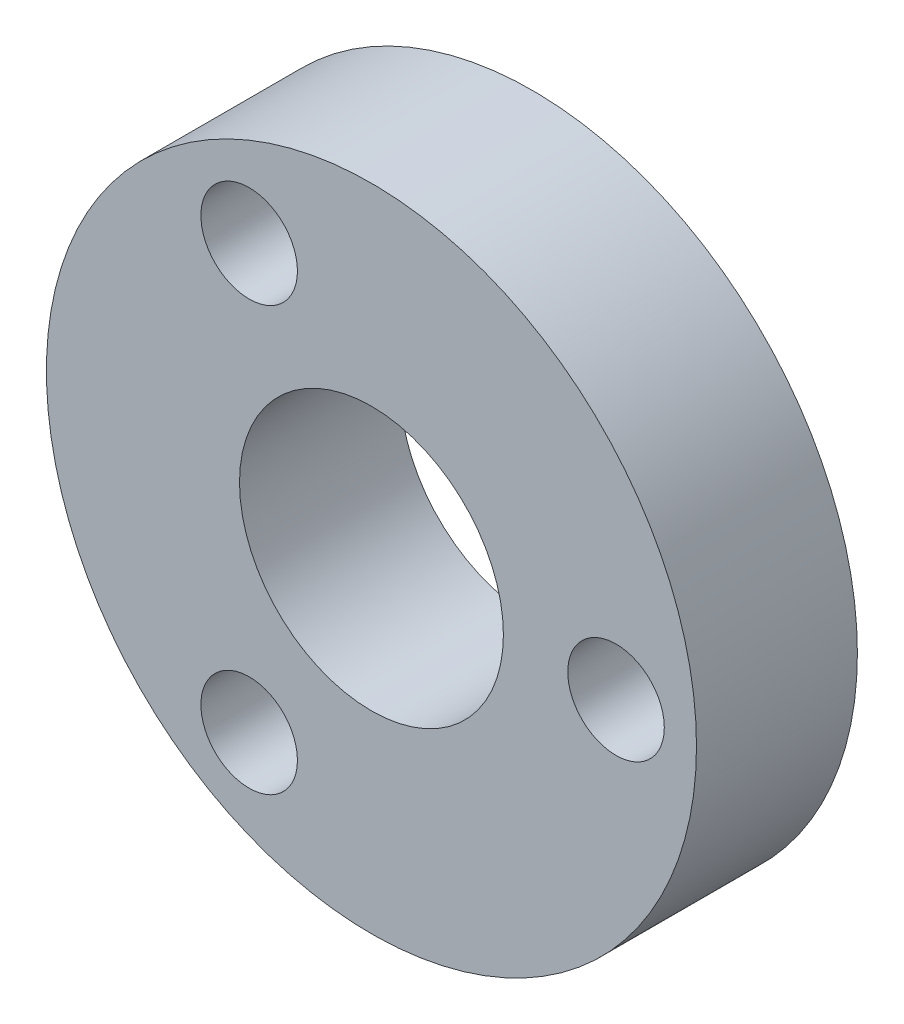
ISO-10303-21;
HEADER;
FILE_DESCRIPTION(('STEP AP214'),'2;1');
FILE_NAME('part.step','',(''),(''),'','','');
FILE_SCHEMA(('AUTOMOTIVE_DESIGN { 1 0 10303 214 1 1 1 1 }'));
ENDSEC;
DATA;
#1=APPLICATION_CONTEXT('core data for automotive mechanical design processes');
#2=APPLICATION_PROTOCOL_DEFINITION('international standard','automotive_design',2000,#1);
#3=PRODUCT_CONTEXT('',#1,'mechanical');
#4=PRODUCT('Part','Part','',(#3));
#5=PRODUCT_RELATED_PRODUCT_CATEGORY('part','',(#4));
#6=PRODUCT_DEFINITION_FORMATION('','',#4);
#7=PRODUCT_DEFINITION_CONTEXT('part definition',#1,'design');
#8=PRODUCT_DEFINITION('design','',#6,#7);
#9=PRODUCT_DEFINITION_SHAPE('','',#8);
#10=(LENGTH_UNIT() NAMED_UNIT(*) SI_UNIT(.MILLI.,.METRE.));
#11=(NAMED_UNIT(*) PLANE_ANGLE_UNIT() SI_UNIT($,.RADIAN.));
#12=(NAMED_UNIT(*) SI_UNIT($,.STERADIAN.) SOLID_ANGLE_UNIT());
#13=UNCERTAINTY_MEASURE_WITH_UNIT(LENGTH_MEASURE(1.E-05),#10,'distance_accuracy_value','');
#14=(GEOMETRIC_REPRESENTATION_CONTEXT(3) GLOBAL_UNCERTAINTY_ASSIGNED_CONTEXT((#13)) GLOBAL_UNIT_ASSIGNED_CONTEXT((#10,
#11,#12)) REPRESENTATION_CONTEXT('',''));
#15=CARTESIAN_POINT('',(0.,0.,0.));
#16=DIRECTION('',(0.,0.,1.));
#17=DIRECTION('',(1.,0.,0.));
#18=AXIS2_PLACEMENT_3D('',#15,#16,#17);
#19=CARTESIAN_POINT('',(0.,0.,5.));
#20=DIRECTION('',(0.,0.,1.));
#21=DIRECTION('',(1.,0.,0.));
#22=AXIS2_PLACEMENT_3D('',#19,#20,#21);
#23=PLANE('',#22);
#24=CARTESIAN_POINT('',(-3.8,-6.58179306876173,5.));
#25=DIRECTION('',(0.,0.,1.));
#26=DIRECTION('',(1.,0.,0.));
#27=AXIS2_PLACEMENT_3D('',#24,#25,#26);
#28=CIRCLE('',#27,1.49999999999996);
#29=CARTESIAN_POINT('',(-2.30000000000004,-6.58179306876173,5.));
#30=VERTEX_POINT('',#29);
#31=EDGE_CURVE('E53',#30,#30,#28,.T.);
#32=ORIENTED_EDGE('',*,*,#31,.F.);
#33=EDGE_LOOP('',(#32));
#34=FACE_BOUND('',#33,.T.);
#35=CARTESIAN_POINT('',(0.,0.,5.));
#36=DIRECTION('',(0.,0.,1.));
#37=DIRECTION('',(1.,0.,0.));
#38=AXIS2_PLACEMENT_3D('',#35,#36,#37);
#39=CIRCLE('',#38,4.1);
#40=CARTESIAN_POINT('',(4.1,0.,5.));
#41=VERTEX_POINT('',#40);
#42=EDGE_CURVE('E42',#41,#41,#39,.T.);
#43=ORIENTED_EDGE('',*,*,#42,.F.);
#44=EDGE_LOOP('',(#43));
#45=FACE_BOUND('',#44,.T.);
#46=CARTESIAN_POINT('',(0.,0.,5.));
#47=DIRECTION('',(0.,0.,1.));
#48=DIRECTION('',(1.,0.,0.));
#49=AXIS2_PLACEMENT_3D('',#46,#47,#48);
#50=CIRCLE('',#49,10.1);
#51=CARTESIAN_POINT('',(10.1,0.,5.));
#52=VERTEX_POINT('',#51);
#53=EDGE_CURVE('E10',#52,#52,#50,.T.);
#54=ORIENTED_EDGE('',*,*,#53,.T.);
#55=EDGE_LOOP('',(#54));
#56=FACE_BOUND('',#55,.T.);
#57=CARTESIAN_POINT('',(7.6,0.,5.));
#58=DIRECTION('',(0.,0.,1.));
#59=DIRECTION('',(1.,0.,0.));
#60=AXIS2_PLACEMENT_3D('',#57,#58,#59);
#61=CIRCLE('',#60,1.5);
#62=CARTESIAN_POINT('',(9.1,0.,5.));
#63=VERTEX_POINT('',#62);
#64=EDGE_CURVE('E47',#63,#63,#61,.T.);
#65=ORIENTED_EDGE('',*,*,#64,.F.);
#66=EDGE_LOOP('',(#65));
#67=FACE_BOUND('',#66,.T.);
#68=CARTESIAN_POINT('',(-3.79999999999994,6.58179306876177,5.));
#69=DIRECTION('',(0.,0.,1.));
#70=DIRECTION('',(1.,0.,0.));
#71=AXIS2_PLACEMENT_3D('',#68,#69,#70);
#72=CIRCLE('',#71,1.5);
#73=CARTESIAN_POINT('',(-2.29999999999994,6.58179306876177,5.));
#74=VERTEX_POINT('',#73);
#75=EDGE_CURVE('E59',#74,#74,#72,.T.);
#76=ORIENTED_EDGE('',*,*,#75,.F.);
#77=EDGE_LOOP('',(#76));
#78=FACE_BOUND('',#77,.T.);
#79=ADVANCED_FACE('F31',(#34,#45,#56,#67,#78),#23,.T.);
#80=CARTESIAN_POINT('',(0.,0.,0.));
#81=DIRECTION('',(0.,0.,1.));
#82=DIRECTION('',(1.,0.,0.));
#83=AXIS2_PLACEMENT_3D('',#80,#81,#82);
#84=PLANE('',#83);
#85=CARTESIAN_POINT('',(0.,0.,0.));
#86=DIRECTION('',(0.,0.,1.));
#87=DIRECTION('',(1.,0.,0.));
#88=AXIS2_PLACEMENT_3D('',#85,#86,#87);
#89=CIRCLE('',#88,10.1);
#90=CARTESIAN_POINT('',(10.1,0.,0.));
#91=VERTEX_POINT('',#90);
#92=EDGE_CURVE('E35',#91,#91,#89,.T.);
#93=ORIENTED_EDGE('',*,*,#92,.F.);
#94=EDGE_LOOP('',(#93));
#95=FACE_BOUND('',#94,.T.);
#96=CARTESIAN_POINT('',(0.,0.,0.));
#97=DIRECTION('',(0.,0.,1.));
#98=DIRECTION('',(1.,0.,0.));
#99=AXIS2_PLACEMENT_3D('',#96,#97,#98);
#100=CIRCLE('',#99,4.1);
#101=CARTESIAN_POINT('',(4.1,0.,0.));
#102=VERTEX_POINT('',#101);
#103=EDGE_CURVE('E44',#102,#102,#100,.T.);
#104=ORIENTED_EDGE('',*,*,#103,.T.);
#105=EDGE_LOOP('',(#104));
#106=FACE_BOUND('',#105,.T.);
#107=CARTESIAN_POINT('',(7.6,0.,0.));
#108=DIRECTION('',(0.,0.,1.));
#109=DIRECTION('',(1.,0.,0.));
#110=AXIS2_PLACEMENT_3D('',#107,#108,#109);
#111=CIRCLE('',#110,1.5);
#112=CARTESIAN_POINT('',(9.1,0.,0.));
#113=VERTEX_POINT('',#112);
#114=EDGE_CURVE('E50',#113,#113,#111,.T.);
#115=ORIENTED_EDGE('',*,*,#114,.T.);
#116=EDGE_LOOP('',(#115));
#117=FACE_BOUND('',#116,.T.);
#118=CARTESIAN_POINT('',(-3.8,-6.58179306876173,0.));
#119=DIRECTION('',(0.,0.,1.));
#120=DIRECTION('',(1.,0.,0.));
#121=AXIS2_PLACEMENT_3D('',#118,#119,#120);
#122=CIRCLE('',#121,1.49999999999996);
#123=CARTESIAN_POINT('',(-2.30000000000004,-6.58179306876173,0.));
#124=VERTEX_POINT('',#123);
#125=EDGE_CURVE('E56',#124,#124,#122,.T.);
#126=ORIENTED_EDGE('',*,*,#125,.T.);
#127=EDGE_LOOP('',(#126));
#128=FACE_BOUND('',#127,.T.);
#129=CARTESIAN_POINT('',(-3.79999999999994,6.58179306876177,0.));
#130=DIRECTION('',(0.,0.,1.));
#131=DIRECTION('',(1.,0.,0.));
#132=AXIS2_PLACEMENT_3D('',#129,#130,#131);
#133=CIRCLE('',#132,1.5);
#134=CARTESIAN_POINT('',(-2.29999999999994,6.58179306876177,0.));
#135=VERTEX_POINT('',#134);
#136=EDGE_CURVE('E62',#135,#135,#133,.T.);
#137=ORIENTED_EDGE('',*,*,#136,.T.);
#138=EDGE_LOOP('',(#137));
#139=FACE_BOUND('',#138,.T.);
#140=ADVANCED_FACE('F72',(#95,#106,#117,#128,#139),#84,.F.);
#141=CARTESIAN_POINT('',(0.,0.,5.));
#142=DIRECTION('',(0.,0.,-1.));
#143=DIRECTION('',(-1.,0.,0.));
#144=AXIS2_PLACEMENT_3D('',#141,#142,#143);
#145=CYLINDRICAL_SURFACE('',#144,10.1);
#146=ORIENTED_EDGE('',*,*,#53,.F.);
#147=EDGE_LOOP('',(#146));
#148=FACE_BOUND('',#147,.T.);
#149=ORIENTED_EDGE('',*,*,#92,.T.);
#150=EDGE_LOOP('',(#149));
#151=FACE_BOUND('',#150,.T.);
#152=ADVANCED_FACE('F33',(#148,#151),#145,.T.);
#153=CARTESIAN_POINT('',(0.,0.,5.));
#154=DIRECTION('',(0.,0.,-1.));
#155=DIRECTION('',(-1.,0.,0.));
#156=AXIS2_PLACEMENT_3D('',#153,#154,#155);
#157=CYLINDRICAL_SURFACE('',#156,4.1);
#158=ORIENTED_EDGE('',*,*,#42,.T.);
#159=EDGE_LOOP('',(#158));
#160=FACE_BOUND('',#159,.T.);
#161=ORIENTED_EDGE('',*,*,#103,.F.);
#162=EDGE_LOOP('',(#161));
#163=FACE_BOUND('',#162,.T.);
#164=ADVANCED_FACE('F82',(#160,#163),#157,.F.);
#165=CARTESIAN_POINT('',(7.6,0.,5.));
#166=DIRECTION('',(0.,0.,-1.));
#167=DIRECTION('',(-1.,0.,0.));
#168=AXIS2_PLACEMENT_3D('',#165,#166,#167);
#169=CYLINDRICAL_SURFACE('',#168,1.5);
#170=ORIENTED_EDGE('',*,*,#64,.T.);
#171=EDGE_LOOP('',(#170));
#172=FACE_BOUND('',#171,.T.);
#173=ORIENTED_EDGE('',*,*,#114,.F.);
#174=EDGE_LOOP('',(#173));
#175=FACE_BOUND('',#174,.T.);
#176=ADVANCED_FACE('F85',(#172,#175),#169,.F.);
#177=CARTESIAN_POINT('',(-3.8,-6.58179306876173,5.));
#178=DIRECTION('',(0.,0.,-1.));
#179=DIRECTION('',(-1.,0.,0.));
#180=AXIS2_PLACEMENT_3D('',#177,#178,#179);
#181=CYLINDRICAL_SURFACE('',#180,1.49999999999996);
#182=ORIENTED_EDGE('',*,*,#31,.T.);
#183=EDGE_LOOP('',(#182));
#184=FACE_BOUND('',#183,.T.);
#185=ORIENTED_EDGE('',*,*,#125,.F.);
#186=EDGE_LOOP('',(#185));
#187=FACE_BOUND('',#186,.T.);
#188=ADVANCED_FACE('F89',(#184,#187),#181,.F.);
#189=CARTESIAN_POINT('',(-3.79999999999994,6.58179306876177,5.));
#190=DIRECTION('',(0.,0.,-1.));
#191=DIRECTION('',(-1.,0.,0.));
#192=AXIS2_PLACEMENT_3D('',#189,#190,#191);
#193=CYLINDRICAL_SURFACE('',#192,1.5);
#194=ORIENTED_EDGE('',*,*,#75,.T.);
#195=EDGE_LOOP('',(#194));
#196=FACE_BOUND('',#195,.T.);
#197=ORIENTED_EDGE('',*,*,#136,.F.);
#198=EDGE_LOOP('',(#197));
#199=FACE_BOUND('',#198,.T.);
#200=ADVANCED_FACE('F68',(#196,#199),#193,.F.);
#201=CLOSED_SHELL('',(#79,#140,#152,#164,#176,#188,#200));
#202=MANIFOLD_SOLID_BREP('B2',#201);
#203=ADVANCED_BREP_SHAPE_REPRESENTATION('',(#18,#202),#14);
#204=SHAPE_DEFINITION_REPRESENTATION(#9,#203);
ENDSEC;
END-ISO-10303-21;
